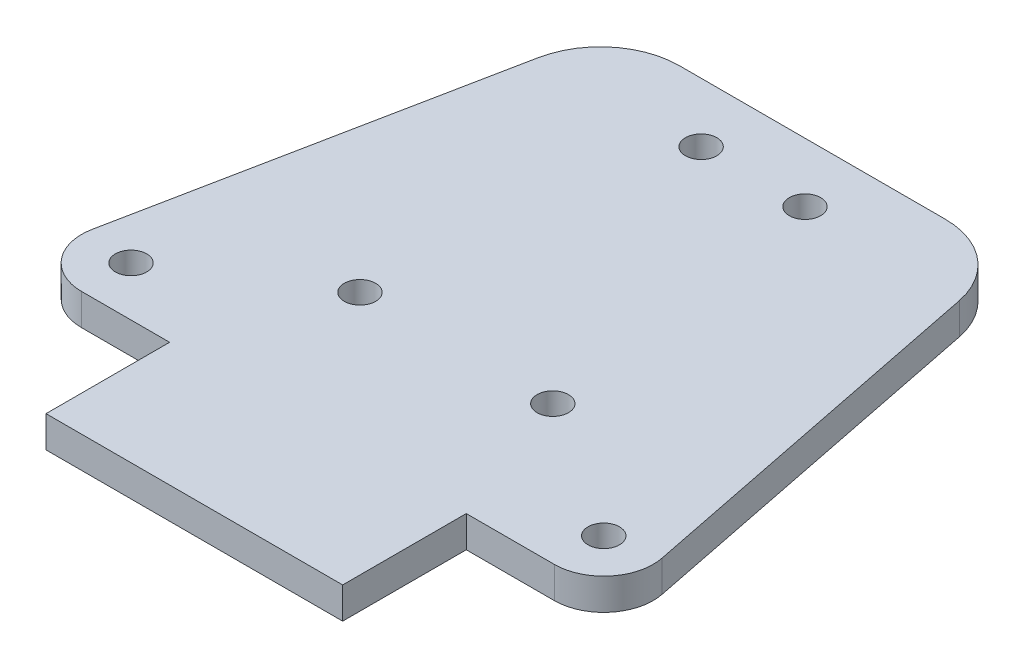
ISO-10303-21;
HEADER;
FILE_DESCRIPTION(('STEP AP214'),'2;1');
FILE_NAME('part.step','',(''),(''),'','','');
FILE_SCHEMA(('AUTOMOTIVE_DESIGN { 1 0 10303 214 1 1 1 1 }'));
ENDSEC;
DATA;
#1=APPLICATION_CONTEXT('core data for automotive mechanical design processes');
#2=APPLICATION_PROTOCOL_DEFINITION('international standard','automotive_design',2000,#1);
#3=PRODUCT_CONTEXT('',#1,'mechanical');
#4=PRODUCT('Part','Part','',(#3));
#5=PRODUCT_RELATED_PRODUCT_CATEGORY('part','',(#4));
#6=PRODUCT_DEFINITION_FORMATION('','',#4);
#7=PRODUCT_DEFINITION_CONTEXT('part definition',#1,'design');
#8=PRODUCT_DEFINITION('design','',#6,#7);
#9=PRODUCT_DEFINITION_SHAPE('','',#8);
#10=(LENGTH_UNIT() NAMED_UNIT(*) SI_UNIT(.MILLI.,.METRE.));
#11=(NAMED_UNIT(*) PLANE_ANGLE_UNIT() SI_UNIT($,.RADIAN.));
#12=(NAMED_UNIT(*) SI_UNIT($,.STERADIAN.) SOLID_ANGLE_UNIT());
#13=UNCERTAINTY_MEASURE_WITH_UNIT(LENGTH_MEASURE(1.E-05),#10,'distance_accuracy_value','');
#14=(GEOMETRIC_REPRESENTATION_CONTEXT(3) GLOBAL_UNCERTAINTY_ASSIGNED_CONTEXT((#13)) GLOBAL_UNIT_ASSIGNED_CONTEXT((#10,
#11,#12)) REPRESENTATION_CONTEXT('',''));
#15=CARTESIAN_POINT('',(0.,0.,0.));
#16=DIRECTION('',(0.,0.,1.));
#17=DIRECTION('',(1.,0.,0.));
#18=AXIS2_PLACEMENT_3D('',#15,#16,#17);
#19=CARTESIAN_POINT('',(0.,3.175,0.));
#20=DIRECTION('',(0.,0.,-1.));
#21=DIRECTION('',(-1.,0.,0.));
#22=AXIS2_PLACEMENT_3D('',#19,#20,#21);
#23=PLANE('',#22);
#24=DIRECTION('',(1.,0.,0.));
#25=VECTOR('',#24,1.);
#26=CARTESIAN_POINT('',(0.,0.,0.));
#27=LINE('',#26,#25);
#28=CARTESIAN_POINT('',(6.09901951359281,0.,0.));
#29=VERTEX_POINT('',#28);
#30=CARTESIAN_POINT('',(15.,0.,0.));
#31=VERTEX_POINT('',#30);
#32=EDGE_CURVE('E243',#29,#31,#27,.T.);
#33=ORIENTED_EDGE('',*,*,#32,.T.);
#34=DIRECTION('',(0.,1.,0.));
#35=VECTOR('',#34,1.);
#36=CARTESIAN_POINT('',(15.,0.,0.));
#37=LINE('',#36,#35);
#38=CARTESIAN_POINT('',(15.,3.175,0.));
#39=VERTEX_POINT('',#38);
#40=EDGE_CURVE('E55',#31,#39,#37,.T.);
#41=ORIENTED_EDGE('',*,*,#40,.T.);
#42=DIRECTION('',(1.,0.,0.));
#43=VECTOR('',#42,1.);
#44=CARTESIAN_POINT('',(0.,3.175,0.));
#45=LINE('',#44,#43);
#46=CARTESIAN_POINT('',(6.09901951359281,3.175,0.));
#47=VERTEX_POINT('',#46);
#48=EDGE_CURVE('E228',#47,#39,#45,.T.);
#49=ORIENTED_EDGE('',*,*,#48,.F.);
#50=DIRECTION('',(0.,1.,0.));
#51=VECTOR('',#50,1.);
#52=CARTESIAN_POINT('',(6.09901951359281,0.,0.));
#53=LINE('',#52,#51);
#54=EDGE_CURVE('E176',#29,#47,#53,.T.);
#55=ORIENTED_EDGE('',*,*,#54,.F.);
#56=EDGE_LOOP('',(#33,#41,#49,#55));
#57=FACE_BOUND('',#56,.T.);
#58=ADVANCED_FACE('F32',(#57),#23,.F.);
#59=CARTESIAN_POINT('',(45.,3.175,0.));
#60=VERTEX_POINT('',#59);
#61=CARTESIAN_POINT('',(53.9009804864072,3.175,0.));
#62=VERTEX_POINT('',#61);
#63=EDGE_CURVE('E47',#60,#62,#45,.T.);
#64=ORIENTED_EDGE('',*,*,#63,.F.);
#65=DIRECTION('',(0.,1.,0.));
#66=VECTOR('',#65,1.);
#67=CARTESIAN_POINT('',(45.,0.,0.));
#68=LINE('',#67,#66);
#69=CARTESIAN_POINT('',(45.,0.,0.));
#70=VERTEX_POINT('',#69);
#71=EDGE_CURVE('E158',#70,#60,#68,.T.);
#72=ORIENTED_EDGE('',*,*,#71,.F.);
#73=CARTESIAN_POINT('',(53.9009804864072,0.,0.));
#74=VERTEX_POINT('',#73);
#75=EDGE_CURVE('E242',#70,#74,#27,.T.);
#76=ORIENTED_EDGE('',*,*,#75,.T.);
#77=DIRECTION('',(0.,1.,0.));
#78=VECTOR('',#77,1.);
#79=CARTESIAN_POINT('',(53.9009804864072,0.,0.));
#80=LINE('',#79,#78);
#81=EDGE_CURVE('E164',#74,#62,#80,.T.);
#82=ORIENTED_EDGE('',*,*,#81,.T.);
#83=EDGE_LOOP('',(#64,#72,#76,#82));
#84=FACE_BOUND('',#83,.T.);
#85=ADVANCED_FACE('F283',(#84),#23,.F.);
#86=CARTESIAN_POINT('',(8.71378581622126,3.175,-43.5689290811055));
#87=DIRECTION('',(0.980580675690919,0.,0.196116135138188));
#88=DIRECTION('',(0.196116135138188,0.,-0.98058067569092));
#89=AXIS2_PLACEMENT_3D('',#86,#87,#88);
#90=PLANE('',#89);
#91=DIRECTION('',(0.,1.,0.));
#92=VECTOR('',#91,1.);
#93=CARTESIAN_POINT('',(1.19611613513821,0.,-5.98058067569094));
#94=LINE('',#93,#92);
#95=CARTESIAN_POINT('',(1.19611613513821,0.,-5.98058067569094));
#96=VERTEX_POINT('',#95);
#97=CARTESIAN_POINT('',(1.19611613513821,3.175,-5.98058067569094));
#98=VERTEX_POINT('',#97);
#99=EDGE_CURVE('E174',#96,#98,#94,.T.);
#100=ORIENTED_EDGE('',*,*,#99,.T.);
#101=DIRECTION('',(-0.196116135138188,0.,0.980580675690919));
#102=VECTOR('',#101,1.);
#103=CARTESIAN_POINT('',(8.71378581622126,3.175,-43.5689290811055));
#104=LINE('',#103,#102);
#105=CARTESIAN_POINT('',(8.71378581622126,3.175,-43.5689290811055));
#106=VERTEX_POINT('',#105);
#107=EDGE_CURVE('E225',#106,#98,#104,.T.);
#108=ORIENTED_EDGE('',*,*,#107,.F.);
#109=DIRECTION('',(0.,-1.,0.));
#110=VECTOR('',#109,1.);
#111=CARTESIAN_POINT('',(8.71378581622126,3.175,-43.5689290811055));
#112=LINE('',#111,#110);
#113=CARTESIAN_POINT('',(8.71378581622126,0.,-43.5689290811055));
#114=VERTEX_POINT('',#113);
#115=EDGE_CURVE('E248',#106,#114,#112,.T.);
#116=ORIENTED_EDGE('',*,*,#115,.T.);
#117=DIRECTION('',(-0.196116135138188,0.,0.980580675690919));
#118=VECTOR('',#117,1.);
#119=CARTESIAN_POINT('',(8.71378581622126,0.,-43.5689290811055));
#120=LINE('',#119,#118);
#121=EDGE_CURVE('E239',#114,#96,#120,.T.);
#122=ORIENTED_EDGE('',*,*,#121,.T.);
#123=EDGE_LOOP('',(#100,#108,#116,#122));
#124=FACE_BOUND('',#123,.T.);
#125=ADVANCED_FACE('F261',(#124),#90,.F.);
#126=CARTESIAN_POINT('',(43.4415687782517,3.175,-42.));
#127=DIRECTION('',(0.,1.,0.));
#128=DIRECTION('',(0.,0.,1.));
#129=AXIS2_PLACEMENT_3D('',#126,#127,#128);
#130=PLANE('',#129);
#131=CARTESIAN_POINT('',(53.9009804864072,3.175,-5.));
#132=DIRECTION('',(0.,-1.,0.));
#133=DIRECTION('',(0.,0.,1.));
#134=AXIS2_PLACEMENT_3D('',#131,#132,#133);
#135=CIRCLE('',#134,5.);
#136=CARTESIAN_POINT('',(58.8038838648618,3.175,-5.9805806756909));
#137=VERTEX_POINT('',#136);
#138=EDGE_CURVE('E157',#137,#62,#135,.T.);
#139=ORIENTED_EDGE('',*,*,#138,.F.);
#140=DIRECTION('',(-0.19611613513818,0.,-0.980580675690921));
#141=VECTOR('',#140,1.);
#142=CARTESIAN_POINT('',(51.2862141837791,3.175,-43.5689290811054));
#143=LINE('',#142,#141);
#144=CARTESIAN_POINT('',(51.2862141837791,3.175,-43.5689290811054));
#145=VERTEX_POINT('',#144);
#146=EDGE_CURVE('E230',#137,#145,#143,.T.);
#147=ORIENTED_EDGE('',*,*,#146,.T.);
#148=CARTESIAN_POINT('',(43.4415687782517,3.175,-42.));
#149=DIRECTION('',(0.,1.,0.));
#150=DIRECTION('',(0.,0.,1.));
#151=AXIS2_PLACEMENT_3D('',#148,#149,#150);
#152=CIRCLE('',#151,8.);
#153=CARTESIAN_POINT('',(43.4415687782517,3.175,-50.));
#154=VERTEX_POINT('',#153);
#155=EDGE_CURVE('E217',#145,#154,#152,.T.);
#156=ORIENTED_EDGE('',*,*,#155,.T.);
#157=DIRECTION('',(-1.,0.,0.));
#158=VECTOR('',#157,1.);
#159=CARTESIAN_POINT('',(16.5584312217487,3.175,-50.));
#160=LINE('',#159,#158);
#161=CARTESIAN_POINT('',(16.5584312217487,3.175,-50.));
#162=VERTEX_POINT('',#161);
#163=EDGE_CURVE('E220',#154,#162,#160,.T.);
#164=ORIENTED_EDGE('',*,*,#163,.T.);
#165=CARTESIAN_POINT('',(16.5584312217486,3.175,-42.));
#166=DIRECTION('',(0.,1.,0.));
#167=DIRECTION('',(0.,0.,-1.));
#168=AXIS2_PLACEMENT_3D('',#165,#166,#167);
#169=CIRCLE('',#168,8.);
#170=EDGE_CURVE('E223',#162,#106,#169,.T.);
#171=ORIENTED_EDGE('',*,*,#170,.T.);
#172=ORIENTED_EDGE('',*,*,#107,.T.);
#173=CARTESIAN_POINT('',(6.09901951359281,3.175,-5.));
#174=DIRECTION('',(0.,-1.,0.));
#175=DIRECTION('',(0.,0.,1.));
#176=AXIS2_PLACEMENT_3D('',#173,#174,#175);
#177=CIRCLE('',#176,5.);
#178=EDGE_CURVE('E169',#47,#98,#177,.T.);
#179=ORIENTED_EDGE('',*,*,#178,.F.);
#180=ORIENTED_EDGE('',*,*,#48,.T.);
#181=DIRECTION('',(0.,0.,1.));
#182=VECTOR('',#181,1.);
#183=CARTESIAN_POINT('',(15.,3.175,0.));
#184=LINE('',#183,#182);
#185=CARTESIAN_POINT('',(15.,3.175,12.5));
#186=VERTEX_POINT('',#185);
#187=EDGE_CURVE('E153',#39,#186,#184,.T.);
#188=ORIENTED_EDGE('',*,*,#187,.T.);
#189=DIRECTION('',(1.,0.,0.));
#190=VECTOR('',#189,1.);
#191=CARTESIAN_POINT('',(45.,3.175,12.5));
#192=LINE('',#191,#190);
#193=CARTESIAN_POINT('',(45.,3.175,12.5));
#194=VERTEX_POINT('',#193);
#195=EDGE_CURVE('E128',#186,#194,#192,.T.);
#196=ORIENTED_EDGE('',*,*,#195,.T.);
#197=DIRECTION('',(0.,0.,-1.));
#198=VECTOR('',#197,1.);
#199=CARTESIAN_POINT('',(45.,3.175,0.));
#200=LINE('',#199,#198);
#201=EDGE_CURVE('E147',#194,#60,#200,.T.);
#202=ORIENTED_EDGE('',*,*,#201,.T.);
#203=ORIENTED_EDGE('',*,*,#63,.T.);
#204=EDGE_LOOP('',(#139,#147,#156,#164,#171,#172,#179,#180,#188,#196,#202,#203));
#205=FACE_BOUND('',#204,.T.);
#206=CARTESIAN_POINT('',(53.9009804864072,3.175,-5.));
#207=DIRECTION('',(0.,1.,0.));
#208=DIRECTION('',(0.,0.,1.));
#209=AXIS2_PLACEMENT_3D('',#206,#207,#208);
#210=CIRCLE('',#209,1.5875);
#211=CARTESIAN_POINT('',(53.9009804864072,3.175,-3.4125));
#212=VERTEX_POINT('',#211);
#213=EDGE_CURVE('E178',#212,#212,#210,.T.);
#214=ORIENTED_EDGE('',*,*,#213,.F.);
#215=EDGE_LOOP('',(#214));
#216=FACE_BOUND('',#215,.T.);
#217=CARTESIAN_POINT('',(6.09901951359281,3.175,-5.));
#218=DIRECTION('',(0.,1.,0.));
#219=DIRECTION('',(0.,0.,1.));
#220=AXIS2_PLACEMENT_3D('',#217,#218,#219);
#221=CIRCLE('',#220,1.5875);
#222=CARTESIAN_POINT('',(6.09901951359281,3.175,-3.4125));
#223=VERTEX_POINT('',#222);
#224=EDGE_CURVE('E184',#223,#223,#221,.T.);
#225=ORIENTED_EDGE('',*,*,#224,.F.);
#226=EDGE_LOOP('',(#225));
#227=FACE_BOUND('',#226,.T.);
#228=CARTESIAN_POINT('',(24.75,3.175,-44.));
#229=DIRECTION('',(0.,1.,0.));
#230=DIRECTION('',(0.,0.,1.));
#231=AXIS2_PLACEMENT_3D('',#228,#229,#230);
#232=CIRCLE('',#231,1.5875);
#233=CARTESIAN_POINT('',(24.75,3.175,-42.4125));
#234=VERTEX_POINT('',#233);
#235=EDGE_CURVE('E199',#234,#234,#232,.T.);
#236=ORIENTED_EDGE('',*,*,#235,.F.);
#237=EDGE_LOOP('',(#236));
#238=FACE_BOUND('',#237,.T.);
#239=CARTESIAN_POINT('',(39.75,3.175,-14.));
#240=DIRECTION('',(0.,1.,0.));
#241=DIRECTION('',(0.,0.,1.));
#242=AXIS2_PLACEMENT_3D('',#239,#240,#241);
#243=CIRCLE('',#242,1.5875);
#244=CARTESIAN_POINT('',(39.75,3.175,-12.4125));
#245=VERTEX_POINT('',#244);
#246=EDGE_CURVE('E211',#245,#245,#243,.T.);
#247=ORIENTED_EDGE('',*,*,#246,.F.);
#248=EDGE_LOOP('',(#247));
#249=FACE_BOUND('',#248,.T.);
#250=CARTESIAN_POINT('',(20.25,3.175,-14.));
#251=DIRECTION('',(0.,1.,0.));
#252=DIRECTION('',(0.,0.,1.));
#253=AXIS2_PLACEMENT_3D('',#250,#251,#252);
#254=CIRCLE('',#253,1.5875);
#255=CARTESIAN_POINT('',(20.25,3.175,-12.4125));
#256=VERTEX_POINT('',#255);
#257=EDGE_CURVE('E205',#256,#256,#254,.T.);
#258=ORIENTED_EDGE('',*,*,#257,.F.);
#259=EDGE_LOOP('',(#258));
#260=FACE_BOUND('',#259,.T.);
#261=CARTESIAN_POINT('',(35.25,3.175,-44.));
#262=DIRECTION('',(0.,1.,0.));
#263=DIRECTION('',(0.,0.,1.));
#264=AXIS2_PLACEMENT_3D('',#261,#262,#263);
#265=CIRCLE('',#264,1.5875);
#266=CARTESIAN_POINT('',(35.25,3.175,-42.4125));
#267=VERTEX_POINT('',#266);
#268=EDGE_CURVE('E193',#267,#267,#265,.T.);
#269=ORIENTED_EDGE('',*,*,#268,.F.);
#270=EDGE_LOOP('',(#269));
#271=FACE_BOUND('',#270,.T.);
#272=ADVANCED_FACE('F266',(#205,#216,#227,#238,#249,#260,#271),#130,.T.);
#273=CARTESIAN_POINT('',(43.4415687782517,0.,-42.));
#274=DIRECTION('',(0.,1.,0.));
#275=DIRECTION('',(0.,0.,1.));
#276=AXIS2_PLACEMENT_3D('',#273,#274,#275);
#277=PLANE('',#276);
#278=CARTESIAN_POINT('',(53.9009804864072,0.,-5.));
#279=DIRECTION('',(0.,1.,0.));
#280=DIRECTION('',(0.,0.,1.));
#281=AXIS2_PLACEMENT_3D('',#278,#279,#280);
#282=CIRCLE('',#281,1.5875);
#283=CARTESIAN_POINT('',(53.9009804864072,0.,-3.4125));
#284=VERTEX_POINT('',#283);
#285=EDGE_CURVE('E181',#284,#284,#282,.T.);
#286=ORIENTED_EDGE('',*,*,#285,.T.);
#287=EDGE_LOOP('',(#286));
#288=FACE_BOUND('',#287,.T.);
#289=CARTESIAN_POINT('',(6.09901951359281,0.,-5.));
#290=DIRECTION('',(0.,1.,0.));
#291=DIRECTION('',(0.,0.,1.));
#292=AXIS2_PLACEMENT_3D('',#289,#290,#291);
#293=CIRCLE('',#292,1.5875);
#294=CARTESIAN_POINT('',(6.09901951359281,0.,-3.4125));
#295=VERTEX_POINT('',#294);
#296=EDGE_CURVE('E187',#295,#295,#293,.T.);
#297=ORIENTED_EDGE('',*,*,#296,.T.);
#298=EDGE_LOOP('',(#297));
#299=FACE_BOUND('',#298,.T.);
#300=CARTESIAN_POINT('',(24.75,0.,-44.));
#301=DIRECTION('',(0.,1.,0.));
#302=DIRECTION('',(0.,0.,1.));
#303=AXIS2_PLACEMENT_3D('',#300,#301,#302);
#304=CIRCLE('',#303,1.5875);
#305=CARTESIAN_POINT('',(24.75,0.,-42.4125));
#306=VERTEX_POINT('',#305);
#307=EDGE_CURVE('E196',#306,#306,#304,.T.);
#308=ORIENTED_EDGE('',*,*,#307,.T.);
#309=EDGE_LOOP('',(#308));
#310=FACE_BOUND('',#309,.T.);
#311=CARTESIAN_POINT('',(39.75,0.,-14.));
#312=DIRECTION('',(0.,1.,0.));
#313=DIRECTION('',(0.,0.,1.));
#314=AXIS2_PLACEMENT_3D('',#311,#312,#313);
#315=CIRCLE('',#314,1.5875);
#316=CARTESIAN_POINT('',(39.75,0.,-12.4125));
#317=VERTEX_POINT('',#316);
#318=EDGE_CURVE('E208',#317,#317,#315,.T.);
#319=ORIENTED_EDGE('',*,*,#318,.T.);
#320=EDGE_LOOP('',(#319));
#321=FACE_BOUND('',#320,.T.);
#322=DIRECTION('',(-0.19611613513818,0.,-0.980580675690921));
#323=VECTOR('',#322,1.);
#324=CARTESIAN_POINT('',(51.2862141837791,0.,-43.5689290811054));
#325=LINE('',#324,#323);
#326=CARTESIAN_POINT('',(58.8038838648618,0.,-5.98058067569091));
#327=VERTEX_POINT('',#326);
#328=CARTESIAN_POINT('',(51.2862141837791,0.,-43.5689290811054));
#329=VERTEX_POINT('',#328);
#330=EDGE_CURVE('E221',#327,#329,#325,.T.);
#331=ORIENTED_EDGE('',*,*,#330,.F.);
#332=CARTESIAN_POINT('',(53.9009804864072,0.,-5.));
#333=DIRECTION('',(0.,-1.,0.));
#334=DIRECTION('',(0.,0.,1.));
#335=AXIS2_PLACEMENT_3D('',#332,#333,#334);
#336=CIRCLE('',#335,5.);
#337=EDGE_CURVE('E161',#327,#74,#336,.T.);
#338=ORIENTED_EDGE('',*,*,#337,.T.);
#339=ORIENTED_EDGE('',*,*,#75,.F.);
#340=DIRECTION('',(0.,0.,-1.));
#341=VECTOR('',#340,1.);
#342=CARTESIAN_POINT('',(45.,0.,0.));
#343=LINE('',#342,#341);
#344=CARTESIAN_POINT('',(45.,0.,12.5));
#345=VERTEX_POINT('',#344);
#346=EDGE_CURVE('E134',#345,#70,#343,.T.);
#347=ORIENTED_EDGE('',*,*,#346,.F.);
#348=DIRECTION('',(1.,0.,0.));
#349=VECTOR('',#348,1.);
#350=CARTESIAN_POINT('',(45.,0.,12.5));
#351=LINE('',#350,#349);
#352=CARTESIAN_POINT('',(15.,0.,12.5));
#353=VERTEX_POINT('',#352);
#354=EDGE_CURVE('E126',#353,#345,#351,.T.);
#355=ORIENTED_EDGE('',*,*,#354,.F.);
#356=DIRECTION('',(0.,0.,1.));
#357=VECTOR('',#356,1.);
#358=CARTESIAN_POINT('',(15.,0.,0.));
#359=LINE('',#358,#357);
#360=EDGE_CURVE('E143',#31,#353,#359,.T.);
#361=ORIENTED_EDGE('',*,*,#360,.F.);
#362=ORIENTED_EDGE('',*,*,#32,.F.);
#363=CARTESIAN_POINT('',(6.09901951359281,0.,-5.));
#364=DIRECTION('',(0.,-1.,0.));
#365=DIRECTION('',(0.,0.,1.));
#366=AXIS2_PLACEMENT_3D('',#363,#364,#365);
#367=CIRCLE('',#366,5.);
#368=EDGE_CURVE('E171',#29,#96,#367,.T.);
#369=ORIENTED_EDGE('',*,*,#368,.T.);
#370=ORIENTED_EDGE('',*,*,#121,.F.);
#371=CARTESIAN_POINT('',(16.5584312217486,0.,-42.));
#372=DIRECTION('',(0.,1.,0.));
#373=DIRECTION('',(0.,0.,-1.));
#374=AXIS2_PLACEMENT_3D('',#371,#372,#373);
#375=CIRCLE('',#374,8.);
#376=CARTESIAN_POINT('',(16.5584312217487,0.,-50.));
#377=VERTEX_POINT('',#376);
#378=EDGE_CURVE('E237',#377,#114,#375,.T.);
#379=ORIENTED_EDGE('',*,*,#378,.F.);
#380=DIRECTION('',(-1.,0.,0.));
#381=VECTOR('',#380,1.);
#382=CARTESIAN_POINT('',(16.5584312217487,0.,-50.));
#383=LINE('',#382,#381);
#384=CARTESIAN_POINT('',(43.4415687782517,0.,-50.));
#385=VERTEX_POINT('',#384);
#386=EDGE_CURVE('E235',#385,#377,#383,.T.);
#387=ORIENTED_EDGE('',*,*,#386,.F.);
#388=CARTESIAN_POINT('',(43.4415687782517,0.,-42.));
#389=DIRECTION('',(0.,1.,0.));
#390=DIRECTION('',(0.,0.,1.));
#391=AXIS2_PLACEMENT_3D('',#388,#389,#390);
#392=CIRCLE('',#391,8.);
#393=EDGE_CURVE('E214',#329,#385,#392,.T.);
#394=ORIENTED_EDGE('',*,*,#393,.F.);
#395=EDGE_LOOP('',(#331,#338,#339,#347,#355,#361,#362,#369,#370,#379,#387,#394));
#396=FACE_BOUND('',#395,.T.);
#397=CARTESIAN_POINT('',(20.25,0.,-14.));
#398=DIRECTION('',(0.,1.,0.));
#399=DIRECTION('',(0.,0.,1.));
#400=AXIS2_PLACEMENT_3D('',#397,#398,#399);
#401=CIRCLE('',#400,1.5875);
#402=CARTESIAN_POINT('',(20.25,0.,-12.4125));
#403=VERTEX_POINT('',#402);
#404=EDGE_CURVE('E202',#403,#403,#401,.T.);
#405=ORIENTED_EDGE('',*,*,#404,.T.);
#406=EDGE_LOOP('',(#405));
#407=FACE_BOUND('',#406,.T.);
#408=CARTESIAN_POINT('',(35.25,0.,-44.));
#409=DIRECTION('',(0.,1.,0.));
#410=DIRECTION('',(0.,0.,1.));
#411=AXIS2_PLACEMENT_3D('',#408,#409,#410);
#412=CIRCLE('',#411,1.5875);
#413=CARTESIAN_POINT('',(35.25,0.,-42.4125));
#414=VERTEX_POINT('',#413);
#415=EDGE_CURVE('E190',#414,#414,#412,.T.);
#416=ORIENTED_EDGE('',*,*,#415,.T.);
#417=EDGE_LOOP('',(#416));
#418=FACE_BOUND('',#417,.T.);
#419=ADVANCED_FACE('F140',(#288,#299,#310,#321,#396,#407,#418),#277,.F.);
#420=CARTESIAN_POINT('',(43.4415687782517,3.175,-42.));
#421=DIRECTION('',(0.,-1.,0.));
#422=DIRECTION('',(0.,0.,-1.));
#423=AXIS2_PLACEMENT_3D('',#420,#421,#422);
#424=CYLINDRICAL_SURFACE('',#423,8.);
#425=ORIENTED_EDGE('',*,*,#393,.T.);
#426=DIRECTION('',(0.,-1.,0.));
#427=VECTOR('',#426,1.);
#428=CARTESIAN_POINT('',(43.4415687782517,3.175,-50.));
#429=LINE('',#428,#427);
#430=EDGE_CURVE('E11',#154,#385,#429,.T.);
#431=ORIENTED_EDGE('',*,*,#430,.F.);
#432=ORIENTED_EDGE('',*,*,#155,.F.);
#433=DIRECTION('',(0.,-1.,0.));
#434=VECTOR('',#433,1.);
#435=CARTESIAN_POINT('',(51.2862141837791,3.175,-43.5689290811054));
#436=LINE('',#435,#434);
#437=EDGE_CURVE('E232',#145,#329,#436,.T.);
#438=ORIENTED_EDGE('',*,*,#437,.T.);
#439=EDGE_LOOP('',(#425,#431,#432,#438));
#440=FACE_BOUND('',#439,.T.);
#441=ADVANCED_FACE('F34',(#440),#424,.T.);
#442=CARTESIAN_POINT('',(16.5584312217487,3.175,-50.));
#443=DIRECTION('',(0.,0.,1.));
#444=DIRECTION('',(1.,0.,0.));
#445=AXIS2_PLACEMENT_3D('',#442,#443,#444);
#446=PLANE('',#445);
#447=ORIENTED_EDGE('',*,*,#386,.T.);
#448=DIRECTION('',(0.,-1.,0.));
#449=VECTOR('',#448,1.);
#450=CARTESIAN_POINT('',(16.5584312217487,3.175,-50.));
#451=LINE('',#450,#449);
#452=EDGE_CURVE('E40',#162,#377,#451,.T.);
#453=ORIENTED_EDGE('',*,*,#452,.F.);
#454=ORIENTED_EDGE('',*,*,#163,.F.);
#455=ORIENTED_EDGE('',*,*,#430,.T.);
#456=EDGE_LOOP('',(#447,#453,#454,#455));
#457=FACE_BOUND('',#456,.T.);
#458=ADVANCED_FACE('F270',(#457),#446,.F.);
#459=CARTESIAN_POINT('',(16.5584312217486,3.175,-42.));
#460=DIRECTION('',(0.,-1.,0.));
#461=DIRECTION('',(0.,0.,-1.));
#462=AXIS2_PLACEMENT_3D('',#459,#460,#461);
#463=CYLINDRICAL_SURFACE('',#462,8.);
#464=ORIENTED_EDGE('',*,*,#378,.T.);
#465=ORIENTED_EDGE('',*,*,#115,.F.);
#466=ORIENTED_EDGE('',*,*,#170,.F.);
#467=ORIENTED_EDGE('',*,*,#452,.T.);
#468=EDGE_LOOP('',(#464,#465,#466,#467));
#469=FACE_BOUND('',#468,.T.);
#470=ADVANCED_FACE('F255',(#469),#463,.T.);
#471=CARTESIAN_POINT('',(51.2862141837791,3.175,-43.5689290811054));
#472=DIRECTION('',(-0.980580675690921,0.,0.19611613513818));
#473=DIRECTION('',(0.19611613513818,0.,0.980580675690921));
#474=AXIS2_PLACEMENT_3D('',#471,#472,#473);
#475=PLANE('',#474);
#476=ORIENTED_EDGE('',*,*,#146,.F.);
#477=DIRECTION('',(0.,1.,0.));
#478=VECTOR('',#477,1.);
#479=CARTESIAN_POINT('',(58.8038838648618,0.,-5.9805806756909));
#480=LINE('',#479,#478);
#481=EDGE_CURVE('E167',#327,#137,#480,.T.);
#482=ORIENTED_EDGE('',*,*,#481,.F.);
#483=ORIENTED_EDGE('',*,*,#330,.T.);
#484=ORIENTED_EDGE('',*,*,#437,.F.);
#485=EDGE_LOOP('',(#476,#482,#483,#484));
#486=FACE_BOUND('',#485,.T.);
#487=ADVANCED_FACE('F276',(#486),#475,.F.);
#488=CARTESIAN_POINT('',(39.75,3.175,-14.));
#489=DIRECTION('',(0.,-1.,0.));
#490=DIRECTION('',(0.,0.,-1.));
#491=AXIS2_PLACEMENT_3D('',#488,#489,#490);
#492=CYLINDRICAL_SURFACE('',#491,1.5875);
#493=ORIENTED_EDGE('',*,*,#246,.T.);
#494=EDGE_LOOP('',(#493));
#495=FACE_BOUND('',#494,.T.);
#496=ORIENTED_EDGE('',*,*,#318,.F.);
#497=EDGE_LOOP('',(#496));
#498=FACE_BOUND('',#497,.T.);
#499=ADVANCED_FACE('F309',(#495,#498),#492,.F.);
#500=CARTESIAN_POINT('',(20.25,3.175,-14.));
#501=DIRECTION('',(0.,-1.,0.));
#502=DIRECTION('',(0.,0.,-1.));
#503=AXIS2_PLACEMENT_3D('',#500,#501,#502);
#504=CYLINDRICAL_SURFACE('',#503,1.5875);
#505=ORIENTED_EDGE('',*,*,#257,.T.);
#506=EDGE_LOOP('',(#505));
#507=FACE_BOUND('',#506,.T.);
#508=ORIENTED_EDGE('',*,*,#404,.F.);
#509=EDGE_LOOP('',(#508));
#510=FACE_BOUND('',#509,.T.);
#511=ADVANCED_FACE('F312',(#507,#510),#504,.F.);
#512=CARTESIAN_POINT('',(24.75,3.175,-44.));
#513=DIRECTION('',(0.,-1.,0.));
#514=DIRECTION('',(0.,0.,-1.));
#515=AXIS2_PLACEMENT_3D('',#512,#513,#514);
#516=CYLINDRICAL_SURFACE('',#515,1.5875);
#517=ORIENTED_EDGE('',*,*,#235,.T.);
#518=EDGE_LOOP('',(#517));
#519=FACE_BOUND('',#518,.T.);
#520=ORIENTED_EDGE('',*,*,#307,.F.);
#521=EDGE_LOOP('',(#520));
#522=FACE_BOUND('',#521,.T.);
#523=ADVANCED_FACE('F316',(#519,#522),#516,.F.);
#524=CARTESIAN_POINT('',(35.25,3.175,-44.));
#525=DIRECTION('',(0.,-1.,0.));
#526=DIRECTION('',(0.,0.,-1.));
#527=AXIS2_PLACEMENT_3D('',#524,#525,#526);
#528=CYLINDRICAL_SURFACE('',#527,1.5875);
#529=ORIENTED_EDGE('',*,*,#268,.T.);
#530=EDGE_LOOP('',(#529));
#531=FACE_BOUND('',#530,.T.);
#532=ORIENTED_EDGE('',*,*,#415,.F.);
#533=EDGE_LOOP('',(#532));
#534=FACE_BOUND('',#533,.T.);
#535=ADVANCED_FACE('F320',(#531,#534),#528,.F.);
#536=CARTESIAN_POINT('',(6.09901951359281,0.,-5.));
#537=DIRECTION('',(0.,1.,0.));
#538=DIRECTION('',(0.,0.,1.));
#539=AXIS2_PLACEMENT_3D('',#536,#537,#538);
#540=CYLINDRICAL_SURFACE('',#539,1.5875);
#541=ORIENTED_EDGE('',*,*,#296,.F.);
#542=EDGE_LOOP('',(#541));
#543=FACE_BOUND('',#542,.T.);
#544=ORIENTED_EDGE('',*,*,#224,.T.);
#545=EDGE_LOOP('',(#544));
#546=FACE_BOUND('',#545,.T.);
#547=ADVANCED_FACE('F324',(#543,#546),#540,.F.);
#548=CARTESIAN_POINT('',(53.9009804864072,0.,-5.));
#549=DIRECTION('',(0.,1.,0.));
#550=DIRECTION('',(0.,0.,1.));
#551=AXIS2_PLACEMENT_3D('',#548,#549,#550);
#552=CYLINDRICAL_SURFACE('',#551,1.5875);
#553=ORIENTED_EDGE('',*,*,#285,.F.);
#554=EDGE_LOOP('',(#553));
#555=FACE_BOUND('',#554,.T.);
#556=ORIENTED_EDGE('',*,*,#213,.T.);
#557=EDGE_LOOP('',(#556));
#558=FACE_BOUND('',#557,.T.);
#559=ADVANCED_FACE('F328',(#555,#558),#552,.F.);
#560=CARTESIAN_POINT('',(6.09901951359281,0.,-5.));
#561=DIRECTION('',(0.,1.,0.));
#562=DIRECTION('',(0.,0.,1.));
#563=AXIS2_PLACEMENT_3D('',#560,#561,#562);
#564=CYLINDRICAL_SURFACE('',#563,5.);
#565=ORIENTED_EDGE('',*,*,#178,.T.);
#566=ORIENTED_EDGE('',*,*,#99,.F.);
#567=ORIENTED_EDGE('',*,*,#368,.F.);
#568=ORIENTED_EDGE('',*,*,#54,.T.);
#569=EDGE_LOOP('',(#565,#566,#567,#568));
#570=FACE_BOUND('',#569,.T.);
#571=ADVANCED_FACE('F332',(#570),#564,.T.);
#572=CARTESIAN_POINT('',(53.9009804864072,0.,-5.));
#573=DIRECTION('',(0.,1.,0.));
#574=DIRECTION('',(0.,0.,1.));
#575=AXIS2_PLACEMENT_3D('',#572,#573,#574);
#576=CYLINDRICAL_SURFACE('',#575,5.);
#577=ORIENTED_EDGE('',*,*,#138,.T.);
#578=ORIENTED_EDGE('',*,*,#81,.F.);
#579=ORIENTED_EDGE('',*,*,#337,.F.);
#580=ORIENTED_EDGE('',*,*,#481,.T.);
#581=EDGE_LOOP('',(#577,#578,#579,#580));
#582=FACE_BOUND('',#581,.T.);
#583=ADVANCED_FACE('F278',(#582),#576,.T.);
#584=CARTESIAN_POINT('',(15.,0.,0.));
#585=DIRECTION('',(-1.,0.,0.));
#586=DIRECTION('',(0.,0.,1.));
#587=AXIS2_PLACEMENT_3D('',#584,#585,#586);
#588=PLANE('',#587);
#589=ORIENTED_EDGE('',*,*,#187,.F.);
#590=ORIENTED_EDGE('',*,*,#40,.F.);
#591=ORIENTED_EDGE('',*,*,#360,.T.);
#592=DIRECTION('',(0.,1.,0.));
#593=VECTOR('',#592,1.);
#594=CARTESIAN_POINT('',(15.,0.,12.5));
#595=LINE('',#594,#593);
#596=EDGE_CURVE('E123',#353,#186,#595,.T.);
#597=ORIENTED_EDGE('',*,*,#596,.T.);
#598=EDGE_LOOP('',(#589,#590,#591,#597));
#599=FACE_BOUND('',#598,.T.);
#600=ADVANCED_FACE('F146',(#599),#588,.T.);
#601=CARTESIAN_POINT('',(45.,0.,0.));
#602=DIRECTION('',(1.,0.,0.));
#603=DIRECTION('',(0.,0.,-1.));
#604=AXIS2_PLACEMENT_3D('',#601,#602,#603);
#605=PLANE('',#604);
#606=ORIENTED_EDGE('',*,*,#201,.F.);
#607=DIRECTION('',(0.,1.,0.));
#608=VECTOR('',#607,1.);
#609=CARTESIAN_POINT('',(45.,0.,12.5));
#610=LINE('',#609,#608);
#611=EDGE_CURVE('E133',#345,#194,#610,.T.);
#612=ORIENTED_EDGE('',*,*,#611,.F.);
#613=ORIENTED_EDGE('',*,*,#346,.T.);
#614=ORIENTED_EDGE('',*,*,#71,.T.);
#615=EDGE_LOOP('',(#606,#612,#613,#614));
#616=FACE_BOUND('',#615,.T.);
#617=ADVANCED_FACE('F282',(#616),#605,.T.);
#618=CARTESIAN_POINT('',(45.,0.,12.5));
#619=DIRECTION('',(0.,0.,1.));
#620=DIRECTION('',(1.,0.,0.));
#621=AXIS2_PLACEMENT_3D('',#618,#619,#620);
#622=PLANE('',#621);
#623=ORIENTED_EDGE('',*,*,#195,.F.);
#624=ORIENTED_EDGE('',*,*,#596,.F.);
#625=ORIENTED_EDGE('',*,*,#354,.T.);
#626=ORIENTED_EDGE('',*,*,#611,.T.);
#627=EDGE_LOOP('',(#623,#624,#625,#626));
#628=FACE_BOUND('',#627,.T.);
#629=ADVANCED_FACE('F125',(#628),#622,.T.);
#630=CLOSED_SHELL('',(#58,#85,#125,#272,#419,#441,#458,#470,#487,#499,#511,#523,#535,#547,#559,
#571,#583,#600,#617,#629));
#631=MANIFOLD_SOLID_BREP('B2',#630);
#632=ADVANCED_BREP_SHAPE_REPRESENTATION('',(#18,#631),#14);
#633=SHAPE_DEFINITION_REPRESENTATION(#9,#632);
ENDSEC;
END-ISO-10303-21;
